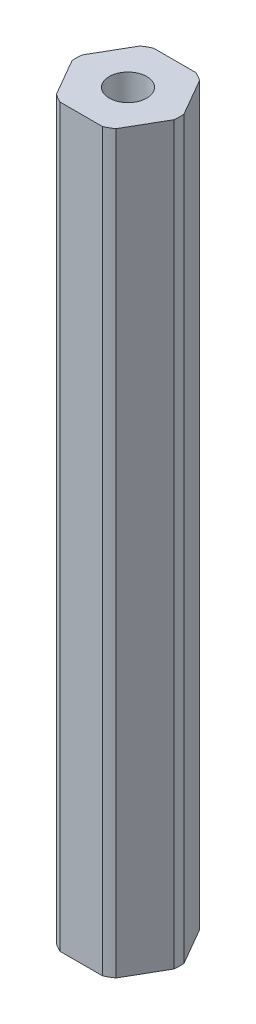
ISO-10303-21;
HEADER;
FILE_DESCRIPTION(('STEP AP214'),'2;1');
FILE_NAME('part.step','',(''),(''),'','','');
FILE_SCHEMA(('AUTOMOTIVE_DESIGN { 1 0 10303 214 1 1 1 1 }'));
ENDSEC;
DATA;
#1=APPLICATION_CONTEXT('core data for automotive mechanical design processes');
#2=APPLICATION_PROTOCOL_DEFINITION('international standard','automotive_design',2000,#1);
#3=PRODUCT_CONTEXT('',#1,'mechanical');
#4=PRODUCT('Part','Part','',(#3));
#5=PRODUCT_RELATED_PRODUCT_CATEGORY('part','',(#4));
#6=PRODUCT_DEFINITION_FORMATION('','',#4);
#7=PRODUCT_DEFINITION_CONTEXT('part definition',#1,'design');
#8=PRODUCT_DEFINITION('design','',#6,#7);
#9=PRODUCT_DEFINITION_SHAPE('','',#8);
#10=(LENGTH_UNIT() NAMED_UNIT(*) SI_UNIT(.MILLI.,.METRE.));
#11=(NAMED_UNIT(*) PLANE_ANGLE_UNIT() SI_UNIT($,.RADIAN.));
#12=(NAMED_UNIT(*) SI_UNIT($,.STERADIAN.) SOLID_ANGLE_UNIT());
#13=UNCERTAINTY_MEASURE_WITH_UNIT(LENGTH_MEASURE(1.E-05),#10,'distance_accuracy_value','');
#14=(GEOMETRIC_REPRESENTATION_CONTEXT(3) GLOBAL_UNCERTAINTY_ASSIGNED_CONTEXT((#13)) GLOBAL_UNIT_ASSIGNED_CONTEXT((#10,
#11,#12)) REPRESENTATION_CONTEXT('',''));
#15=CARTESIAN_POINT('',(0.,0.,0.));
#16=DIRECTION('',(0.,0.,1.));
#17=DIRECTION('',(1.,0.,0.));
#18=AXIS2_PLACEMENT_3D('',#15,#16,#17);
#19=CARTESIAN_POINT('',(0.,50.00625,6.35));
#20=DIRECTION('',(0.,0.,-1.));
#21=DIRECTION('',(-1.,0.,0.));
#22=AXIS2_PLACEMENT_3D('',#19,#20,#21);
#23=PLANE('',#22);
#24=DIRECTION('',(1.,0.,0.));
#25=VECTOR('',#24,1.);
#26=CARTESIAN_POINT('',(0.,-50.00625,6.35));
#27=LINE('',#26,#25);
#28=CARTESIAN_POINT('',(-2.89465988027954,-50.00625,6.35));
#29=VERTEX_POINT('',#28);
#30=CARTESIAN_POINT('',(2.89465988027954,-50.00625,6.35));
#31=VERTEX_POINT('',#30);
#32=EDGE_CURVE('E163',#29,#31,#27,.T.);
#33=ORIENTED_EDGE('',*,*,#32,.T.);
#34=DIRECTION('',(0.,-1.,0.));
#35=VECTOR('',#34,1.);
#36=CARTESIAN_POINT('',(2.89465988027954,50.00625,6.35));
#37=LINE('',#36,#35);
#38=CARTESIAN_POINT('',(2.89465988027954,50.00625,6.35));
#39=VERTEX_POINT('',#38);
#40=EDGE_CURVE('E11',#39,#31,#37,.T.);
#41=ORIENTED_EDGE('',*,*,#40,.F.);
#42=DIRECTION('',(1.,0.,0.));
#43=VECTOR('',#42,1.);
#44=CARTESIAN_POINT('',(0.,50.00625,6.35));
#45=LINE('',#44,#43);
#46=CARTESIAN_POINT('',(-2.89465988027954,50.00625,6.35));
#47=VERTEX_POINT('',#46);
#48=EDGE_CURVE('E222',#47,#39,#45,.T.);
#49=ORIENTED_EDGE('',*,*,#48,.F.);
#50=DIRECTION('',(0.,-1.,0.));
#51=VECTOR('',#50,1.);
#52=CARTESIAN_POINT('',(-2.89465988027954,50.00625,6.35));
#53=LINE('',#52,#51);
#54=EDGE_CURVE('E156',#47,#29,#53,.T.);
#55=ORIENTED_EDGE('',*,*,#54,.T.);
#56=EDGE_LOOP('',(#33,#41,#49,#55));
#57=FACE_BOUND('',#56,.T.);
#58=ADVANCED_FACE('F38',(#57),#23,.F.);
#59=CARTESIAN_POINT('',(0.,50.00625,0.));
#60=DIRECTION('',(0.,-1.,0.));
#61=DIRECTION('',(0.,0.,-1.));
#62=AXIS2_PLACEMENT_3D('',#59,#60,#61);
#63=CYLINDRICAL_SURFACE('',#62,6.97865);
#64=CARTESIAN_POINT('',(0.,-50.00625,0.));
#65=DIRECTION('',(0.,1.,0.));
#66=DIRECTION('',(0.,0.,1.));
#67=AXIS2_PLACEMENT_3D('',#64,#65,#66);
#68=CIRCLE('',#67,6.97865);
#69=CARTESIAN_POINT('',(4.05193137389142,-50.00625,5.68184899163771));
#70=VERTEX_POINT('',#69);
#71=EDGE_CURVE('E166',#31,#70,#68,.T.);
#72=ORIENTED_EDGE('',*,*,#71,.T.);
#73=DIRECTION('',(0.,-1.,0.));
#74=VECTOR('',#73,1.);
#75=CARTESIAN_POINT('',(4.05193137389142,50.00625,5.68184899163771));
#76=LINE('',#75,#74);
#77=CARTESIAN_POINT('',(4.05193137389142,50.00625,5.68184899163771));
#78=VERTEX_POINT('',#77);
#79=EDGE_CURVE('E47',#78,#70,#76,.T.);
#80=ORIENTED_EDGE('',*,*,#79,.F.);
#81=CARTESIAN_POINT('',(0.,50.00625,0.));
#82=DIRECTION('',(0.,1.,0.));
#83=DIRECTION('',(0.,0.,1.));
#84=AXIS2_PLACEMENT_3D('',#81,#82,#83);
#85=CIRCLE('',#84,6.97865);
#86=EDGE_CURVE('E110',#39,#78,#85,.T.);
#87=ORIENTED_EDGE('',*,*,#86,.F.);
#88=ORIENTED_EDGE('',*,*,#40,.T.);
#89=EDGE_LOOP('',(#72,#80,#87,#88));
#90=FACE_BOUND('',#89,.T.);
#91=ADVANCED_FACE('F257',(#90),#63,.T.);
#92=CARTESIAN_POINT('',(5.49926131403119,50.00625,3.175));
#93=DIRECTION('',(-0.866025403784439,0.,-0.5));
#94=DIRECTION('',(-0.5,0.,0.866025403784439));
#95=AXIS2_PLACEMENT_3D('',#92,#93,#94);
#96=PLANE('',#95);
#97=DIRECTION('',(0.5,0.,-0.866025403784439));
#98=VECTOR('',#97,1.);
#99=CARTESIAN_POINT('',(5.49926131403119,-50.00625,3.175));
#100=LINE('',#99,#98);
#101=CARTESIAN_POINT('',(6.94659125417096,-50.00625,0.668151008362288));
#102=VERTEX_POINT('',#101);
#103=EDGE_CURVE('E168',#70,#102,#100,.T.);
#104=ORIENTED_EDGE('',*,*,#103,.T.);
#105=DIRECTION('',(0.,-1.,0.));
#106=VECTOR('',#105,1.);
#107=CARTESIAN_POINT('',(6.94659125417096,50.00625,0.668151008362288));
#108=LINE('',#107,#106);
#109=CARTESIAN_POINT('',(6.94659125417096,50.00625,0.668151008362288));
#110=VERTEX_POINT('',#109);
#111=EDGE_CURVE('E198',#110,#102,#108,.T.);
#112=ORIENTED_EDGE('',*,*,#111,.F.);
#113=DIRECTION('',(0.5,0.,-0.866025403784439));
#114=VECTOR('',#113,1.);
#115=CARTESIAN_POINT('',(5.49926131403119,50.00625,3.175));
#116=LINE('',#115,#114);
#117=EDGE_CURVE('E206',#78,#110,#116,.T.);
#118=ORIENTED_EDGE('',*,*,#117,.F.);
#119=ORIENTED_EDGE('',*,*,#79,.T.);
#120=EDGE_LOOP('',(#104,#112,#118,#119));
#121=FACE_BOUND('',#120,.T.);
#122=ADVANCED_FACE('F204',(#121),#96,.F.);
#123=CARTESIAN_POINT('',(6.94659125417096,-50.00625,-0.66815100836229));
#124=VERTEX_POINT('',#123);
#125=EDGE_CURVE('E169',#102,#124,#68,.T.);
#126=ORIENTED_EDGE('',*,*,#125,.T.);
#127=DIRECTION('',(0.,-1.,0.));
#128=VECTOR('',#127,1.);
#129=CARTESIAN_POINT('',(6.94659125417096,50.00625,-0.66815100836229));
#130=LINE('',#129,#128);
#131=CARTESIAN_POINT('',(6.94659125417096,50.00625,-0.66815100836229));
#132=VERTEX_POINT('',#131);
#133=EDGE_CURVE('E195',#132,#124,#130,.T.);
#134=ORIENTED_EDGE('',*,*,#133,.F.);
#135=EDGE_CURVE('E228',#110,#132,#85,.T.);
#136=ORIENTED_EDGE('',*,*,#135,.F.);
#137=ORIENTED_EDGE('',*,*,#111,.T.);
#138=EDGE_LOOP('',(#126,#134,#136,#137));
#139=FACE_BOUND('',#138,.T.);
#140=ADVANCED_FACE('F239',(#139),#63,.T.);
#141=CARTESIAN_POINT('',(5.49926131403118,50.00625,-3.175));
#142=DIRECTION('',(-0.866025403784438,0.,0.5));
#143=DIRECTION('',(0.5,0.,0.866025403784438));
#144=AXIS2_PLACEMENT_3D('',#141,#142,#143);
#145=PLANE('',#144);
#146=DIRECTION('',(-0.5,0.,-0.866025403784438));
#147=VECTOR('',#146,1.);
#148=CARTESIAN_POINT('',(5.49926131403118,-50.00625,-3.175));
#149=LINE('',#148,#147);
#150=CARTESIAN_POINT('',(4.05193137389141,-50.00625,-5.68184899163771));
#151=VERTEX_POINT('',#150);
#152=EDGE_CURVE('E171',#124,#151,#149,.T.);
#153=ORIENTED_EDGE('',*,*,#152,.T.);
#154=DIRECTION('',(0.,-1.,0.));
#155=VECTOR('',#154,1.);
#156=CARTESIAN_POINT('',(4.05193137389141,50.00625,-5.68184899163771));
#157=LINE('',#156,#155);
#158=CARTESIAN_POINT('',(4.05193137389141,50.00625,-5.68184899163771));
#159=VERTEX_POINT('',#158);
#160=EDGE_CURVE('E192',#159,#151,#157,.T.);
#161=ORIENTED_EDGE('',*,*,#160,.F.);
#162=DIRECTION('',(-0.5,0.,-0.866025403784438));
#163=VECTOR('',#162,1.);
#164=CARTESIAN_POINT('',(5.49926131403118,50.00625,-3.175));
#165=LINE('',#164,#163);
#166=EDGE_CURVE('E230',#132,#159,#165,.T.);
#167=ORIENTED_EDGE('',*,*,#166,.F.);
#168=ORIENTED_EDGE('',*,*,#133,.T.);
#169=EDGE_LOOP('',(#153,#161,#167,#168));
#170=FACE_BOUND('',#169,.T.);
#171=ADVANCED_FACE('F241',(#170),#145,.F.);
#172=CARTESIAN_POINT('',(2.89465988027954,-50.00625,-6.35));
#173=VERTEX_POINT('',#172);
#174=EDGE_CURVE('E173',#151,#173,#68,.T.);
#175=ORIENTED_EDGE('',*,*,#174,.T.);
#176=DIRECTION('',(0.,-1.,0.));
#177=VECTOR('',#176,1.);
#178=CARTESIAN_POINT('',(2.89465988027954,50.00625,-6.35));
#179=LINE('',#178,#177);
#180=CARTESIAN_POINT('',(2.89465988027954,50.00625,-6.35));
#181=VERTEX_POINT('',#180);
#182=EDGE_CURVE('E189',#181,#173,#179,.T.);
#183=ORIENTED_EDGE('',*,*,#182,.F.);
#184=EDGE_CURVE('E231',#159,#181,#85,.T.);
#185=ORIENTED_EDGE('',*,*,#184,.F.);
#186=ORIENTED_EDGE('',*,*,#160,.T.);
#187=EDGE_LOOP('',(#175,#183,#185,#186));
#188=FACE_BOUND('',#187,.T.);
#189=ADVANCED_FACE('F242',(#188),#63,.T.);
#190=CARTESIAN_POINT('',(0.,50.00625,-6.35));
#191=DIRECTION('',(0.,0.,1.));
#192=DIRECTION('',(1.,0.,0.));
#193=AXIS2_PLACEMENT_3D('',#190,#191,#192);
#194=PLANE('',#193);
#195=DIRECTION('',(-1.,0.,0.));
#196=VECTOR('',#195,1.);
#197=CARTESIAN_POINT('',(0.,-50.00625,-6.35));
#198=LINE('',#197,#196);
#199=CARTESIAN_POINT('',(-2.89465988027954,-50.00625,-6.35));
#200=VERTEX_POINT('',#199);
#201=EDGE_CURVE('E174',#173,#200,#198,.T.);
#202=ORIENTED_EDGE('',*,*,#201,.T.);
#203=DIRECTION('',(0.,-1.,0.));
#204=VECTOR('',#203,1.);
#205=CARTESIAN_POINT('',(-2.89465988027954,50.00625,-6.35));
#206=LINE('',#205,#204);
#207=CARTESIAN_POINT('',(-2.89465988027954,50.00625,-6.35));
#208=VERTEX_POINT('',#207);
#209=EDGE_CURVE('E186',#208,#200,#206,.T.);
#210=ORIENTED_EDGE('',*,*,#209,.F.);
#211=DIRECTION('',(-1.,0.,0.));
#212=VECTOR('',#211,1.);
#213=CARTESIAN_POINT('',(0.,50.00625,-6.35));
#214=LINE('',#213,#212);
#215=EDGE_CURVE('E232',#181,#208,#214,.T.);
#216=ORIENTED_EDGE('',*,*,#215,.F.);
#217=ORIENTED_EDGE('',*,*,#182,.T.);
#218=EDGE_LOOP('',(#202,#210,#216,#217));
#219=FACE_BOUND('',#218,.T.);
#220=ADVANCED_FACE('F245',(#219),#194,.F.);
#221=CARTESIAN_POINT('',(-4.05193137389142,-50.00625,-5.68184899163771));
#222=VERTEX_POINT('',#221);
#223=EDGE_CURVE('E176',#200,#222,#68,.T.);
#224=ORIENTED_EDGE('',*,*,#223,.T.);
#225=DIRECTION('',(0.,-1.,0.));
#226=VECTOR('',#225,1.);
#227=CARTESIAN_POINT('',(-4.05193137389142,50.00625,-5.68184899163771));
#228=LINE('',#227,#226);
#229=CARTESIAN_POINT('',(-4.05193137389142,50.00625,-5.68184899163771));
#230=VERTEX_POINT('',#229);
#231=EDGE_CURVE('E183',#230,#222,#228,.T.);
#232=ORIENTED_EDGE('',*,*,#231,.F.);
#233=EDGE_CURVE('E146',#208,#230,#85,.T.);
#234=ORIENTED_EDGE('',*,*,#233,.F.);
#235=ORIENTED_EDGE('',*,*,#209,.T.);
#236=EDGE_LOOP('',(#224,#232,#234,#235));
#237=FACE_BOUND('',#236,.T.);
#238=ADVANCED_FACE('F247',(#237),#63,.T.);
#239=CARTESIAN_POINT('',(-5.49926131403119,50.00625,-3.175));
#240=DIRECTION('',(0.866025403784439,0.,0.5));
#241=DIRECTION('',(0.5,0.,-0.866025403784439));
#242=AXIS2_PLACEMENT_3D('',#239,#240,#241);
#243=PLANE('',#242);
#244=DIRECTION('',(-0.5,0.,0.866025403784439));
#245=VECTOR('',#244,1.);
#246=CARTESIAN_POINT('',(-5.49926131403119,-50.00625,-3.175));
#247=LINE('',#246,#245);
#248=CARTESIAN_POINT('',(-6.94659125417096,-50.00625,-0.668151008362297));
#249=VERTEX_POINT('',#248);
#250=EDGE_CURVE('E177',#222,#249,#247,.T.);
#251=ORIENTED_EDGE('',*,*,#250,.T.);
#252=DIRECTION('',(0.,-1.,0.));
#253=VECTOR('',#252,1.);
#254=CARTESIAN_POINT('',(-6.94659125417096,50.00625,-0.668151008362297));
#255=LINE('',#254,#253);
#256=CARTESIAN_POINT('',(-6.94659125417096,50.00625,-0.668151008362297));
#257=VERTEX_POINT('',#256);
#258=EDGE_CURVE('E151',#257,#249,#255,.T.);
#259=ORIENTED_EDGE('',*,*,#258,.F.);
#260=DIRECTION('',(-0.5,0.,0.866025403784439));
#261=VECTOR('',#260,1.);
#262=CARTESIAN_POINT('',(-5.49926131403119,50.00625,-3.175));
#263=LINE('',#262,#261);
#264=EDGE_CURVE('E141',#230,#257,#263,.T.);
#265=ORIENTED_EDGE('',*,*,#264,.F.);
#266=ORIENTED_EDGE('',*,*,#231,.T.);
#267=EDGE_LOOP('',(#251,#259,#265,#266));
#268=FACE_BOUND('',#267,.T.);
#269=ADVANCED_FACE('F250',(#268),#243,.F.);
#270=CARTESIAN_POINT('',(-6.94659125417096,-50.00625,0.668151008362299));
#271=VERTEX_POINT('',#270);
#272=EDGE_CURVE('E150',#249,#271,#68,.T.);
#273=ORIENTED_EDGE('',*,*,#272,.T.);
#274=DIRECTION('',(0.,-1.,0.));
#275=VECTOR('',#274,1.);
#276=CARTESIAN_POINT('',(-6.94659125417096,50.00625,0.668151008362299));
#277=LINE('',#276,#275);
#278=CARTESIAN_POINT('',(-6.94659125417096,50.00625,0.668151008362299));
#279=VERTEX_POINT('',#278);
#280=EDGE_CURVE('E147',#279,#271,#277,.T.);
#281=ORIENTED_EDGE('',*,*,#280,.F.);
#282=EDGE_CURVE('E135',#257,#279,#85,.T.);
#283=ORIENTED_EDGE('',*,*,#282,.F.);
#284=ORIENTED_EDGE('',*,*,#258,.T.);
#285=EDGE_LOOP('',(#273,#281,#283,#284));
#286=FACE_BOUND('',#285,.T.);
#287=ADVANCED_FACE('F148',(#286),#63,.T.);
#288=CARTESIAN_POINT('',(-5.49926131403119,50.00625,3.175));
#289=DIRECTION('',(0.866025403784438,0.,-0.5));
#290=DIRECTION('',(-0.5,0.,-0.866025403784439));
#291=AXIS2_PLACEMENT_3D('',#288,#289,#290);
#292=PLANE('',#291);
#293=DIRECTION('',(0.5,0.,0.866025403784439));
#294=VECTOR('',#293,1.);
#295=CARTESIAN_POINT('',(-5.49926131403119,-50.00625,3.175));
#296=LINE('',#295,#294);
#297=CARTESIAN_POINT('',(-4.05193137389142,-50.00625,5.68184899163771));
#298=VERTEX_POINT('',#297);
#299=EDGE_CURVE('E96',#271,#298,#296,.T.);
#300=ORIENTED_EDGE('',*,*,#299,.T.);
#301=DIRECTION('',(0.,-1.,0.));
#302=VECTOR('',#301,1.);
#303=CARTESIAN_POINT('',(-4.05193137389142,50.00625,5.68184899163771));
#304=LINE('',#303,#302);
#305=CARTESIAN_POINT('',(-4.05193137389142,50.00625,5.68184899163771));
#306=VERTEX_POINT('',#305);
#307=EDGE_CURVE('E152',#306,#298,#304,.T.);
#308=ORIENTED_EDGE('',*,*,#307,.F.);
#309=DIRECTION('',(0.5,0.,0.866025403784439));
#310=VECTOR('',#309,1.);
#311=CARTESIAN_POINT('',(-5.49926131403119,50.00625,3.175));
#312=LINE('',#311,#310);
#313=EDGE_CURVE('E139',#279,#306,#312,.T.);
#314=ORIENTED_EDGE('',*,*,#313,.F.);
#315=ORIENTED_EDGE('',*,*,#280,.T.);
#316=EDGE_LOOP('',(#300,#308,#314,#315));
#317=FACE_BOUND('',#316,.T.);
#318=ADVANCED_FACE('F154',(#317),#292,.F.);
#319=CARTESIAN_POINT('',(0.,50.00625,0.));
#320=DIRECTION('',(0.,-1.,0.));
#321=DIRECTION('',(0.,0.,-1.));
#322=AXIS2_PLACEMENT_3D('',#319,#320,#321);
#323=CYLINDRICAL_SURFACE('',#322,2.5527);
#324=CARTESIAN_POINT('',(0.,50.00625,0.));
#325=DIRECTION('',(0.,1.,0.));
#326=DIRECTION('',(0.,0.,1.));
#327=AXIS2_PLACEMENT_3D('',#324,#325,#326);
#328=CIRCLE('',#327,2.5527);
#329=CARTESIAN_POINT('',(0.,50.00625,-2.5527));
#330=VERTEX_POINT('',#329);
#331=EDGE_CURVE('E220',#330,#330,#328,.T.);
#332=CARTESIAN_POINT('',(0.,-50.00625,0.));
#333=DIRECTION('',(0.,1.,0.));
#334=DIRECTION('',(0.,0.,1.));
#335=AXIS2_PLACEMENT_3D('',#332,#333,#334);
#336=CIRCLE('',#335,2.5527);
#337=CARTESIAN_POINT('',(0.,-50.00625,-2.5527));
#338=VERTEX_POINT('',#337);
#339=EDGE_CURVE('E160',#338,#338,#336,.T.);
#340=CARTESIAN_POINT('',(0.,50.00625,-2.5527));
#341=CARTESIAN_POINT('',(0.,48.964453125,-2.5527));
#342=CARTESIAN_POINT('',(0.,47.92265625,-2.5527));
#343=CARTESIAN_POINT('',(0.,45.8390625,-2.5527));
#344=CARTESIAN_POINT('',(0.,44.797265625,-2.5527));
#345=CARTESIAN_POINT('',(0.,42.713671875,-2.5527));
#346=CARTESIAN_POINT('',(0.,41.671875,-2.5527));
#347=CARTESIAN_POINT('',(0.,39.58828125,-2.5527));
#348=CARTESIAN_POINT('',(0.,38.546484375,-2.5527));
#349=CARTESIAN_POINT('',(0.,36.462890625,-2.5527));
#350=CARTESIAN_POINT('',(0.,35.42109375,-2.5527));
#351=CARTESIAN_POINT('',(0.,33.3375,-2.5527));
#352=CARTESIAN_POINT('',(0.,32.295703125,-2.5527));
#353=CARTESIAN_POINT('',(0.,30.212109375,-2.5527));
#354=CARTESIAN_POINT('',(0.,29.1703125,-2.5527));
#355=CARTESIAN_POINT('',(0.,27.08671875,-2.5527));
#356=CARTESIAN_POINT('',(0.,26.044921875,-2.5527));
#357=CARTESIAN_POINT('',(0.,23.961328125,-2.5527));
#358=CARTESIAN_POINT('',(0.,22.91953125,-2.5527));
#359=CARTESIAN_POINT('',(0.,20.8359375,-2.5527));
#360=CARTESIAN_POINT('',(0.,19.794140625,-2.5527));
#361=CARTESIAN_POINT('',(0.,17.710546875,-2.5527));
#362=CARTESIAN_POINT('',(0.,16.66875,-2.5527));
#363=CARTESIAN_POINT('',(0.,14.58515625,-2.5527));
#364=CARTESIAN_POINT('',(0.,13.543359375,-2.5527));
#365=CARTESIAN_POINT('',(0.,11.459765625,-2.5527));
#366=CARTESIAN_POINT('',(0.,10.41796875,-2.5527));
#367=CARTESIAN_POINT('',(0.,8.33437499999999,-2.5527));
#368=CARTESIAN_POINT('',(0.,7.292578125,-2.5527));
#369=CARTESIAN_POINT('',(0.,5.208984375,-2.5527));
#370=CARTESIAN_POINT('',(0.,4.1671875,-2.5527));
#371=CARTESIAN_POINT('',(0.,2.08359374999999,-2.5527));
#372=CARTESIAN_POINT('',(0.,1.04179687499999,-2.5527));
#373=CARTESIAN_POINT('',(0.,-1.04179687500001,-2.5527));
#374=CARTESIAN_POINT('',(0.,-2.08359375000001,-2.5527));
#375=CARTESIAN_POINT('',(0.,-4.16718750000001,-2.5527));
#376=CARTESIAN_POINT('',(0.,-5.20898437500001,-2.5527));
#377=CARTESIAN_POINT('',(0.,-7.29257812500001,-2.5527));
#378=CARTESIAN_POINT('',(0.,-8.33437500000001,-2.5527));
#379=CARTESIAN_POINT('',(0.,-10.41796875,-2.5527));
#380=CARTESIAN_POINT('',(0.,-11.459765625,-2.5527));
#381=CARTESIAN_POINT('',(0.,-13.543359375,-2.5527));
#382=CARTESIAN_POINT('',(0.,-14.58515625,-2.5527));
#383=CARTESIAN_POINT('',(0.,-16.66875,-2.5527));
#384=CARTESIAN_POINT('',(0.,-17.710546875,-2.5527));
#385=CARTESIAN_POINT('',(0.,-19.794140625,-2.5527));
#386=CARTESIAN_POINT('',(0.,-20.8359375,-2.5527));
#387=CARTESIAN_POINT('',(0.,-22.91953125,-2.5527));
#388=CARTESIAN_POINT('',(0.,-23.961328125,-2.5527));
#389=CARTESIAN_POINT('',(0.,-26.044921875,-2.5527));
#390=CARTESIAN_POINT('',(0.,-27.08671875,-2.5527));
#391=CARTESIAN_POINT('',(0.,-29.1703125,-2.5527));
#392=CARTESIAN_POINT('',(0.,-30.212109375,-2.5527));
#393=CARTESIAN_POINT('',(0.,-32.295703125,-2.5527));
#394=CARTESIAN_POINT('',(0.,-33.3375,-2.5527));
#395=CARTESIAN_POINT('',(0.,-35.42109375,-2.5527));
#396=CARTESIAN_POINT('',(0.,-36.462890625,-2.5527));
#397=CARTESIAN_POINT('',(0.,-38.546484375,-2.5527));
#398=CARTESIAN_POINT('',(0.,-39.58828125,-2.5527));
#399=CARTESIAN_POINT('',(0.,-41.671875,-2.5527));
#400=CARTESIAN_POINT('',(0.,-42.713671875,-2.5527));
#401=CARTESIAN_POINT('',(0.,-44.797265625,-2.5527));
#402=CARTESIAN_POINT('',(0.,-45.8390625,-2.5527));
#403=CARTESIAN_POINT('',(0.,-47.92265625,-2.5527));
#404=CARTESIAN_POINT('',(0.,-48.964453125,-2.5527));
#405=CARTESIAN_POINT('',(0.,-50.00625,-2.5527));
#406=B_SPLINE_CURVE_WITH_KNOTS('',3,(#340,#341,#342,#343,#344,#345,#346,#347,#348,#349,#350,
#351,#352,#353,#354,#355,#356,#357,#358,#359,#360,#361,#362,#363,#364,#365,#366,#367,#368,#369,
#370,#371,#372,#373,#374,#375,#376,#377,#378,#379,#380,#381,#382,#383,#384,#385,#386,#387,#388,
#389,#390,#391,#392,#393,#394,#395,#396,#397,#398,#399,#400,#401,#402,#403,#404,#405),
.UNSPECIFIED.,.F.,.F.,(4,2,2,2,2,2,2,2,2,2,2,2,2,2,2,2,2,2,2,2,2,2,2,2,2,2,2,2,2,2,2,2,4),(0.,
3.12539062499999,6.25078125,9.37617187499999,12.5015625,15.626953125,18.75234375,21.877734375,
25.003125,28.128515625,31.25390625,34.379296875,37.5046875,40.630078125,43.75546875,
46.880859375,50.00625,53.131640625,56.25703125,59.382421875,62.5078125,65.633203125,68.75859375,
71.883984375,75.009375,78.134765625,81.26015625,84.385546875,87.5109375,90.636328125,
93.76171875,96.887109375,100.0125),.UNSPECIFIED.);
#407=EDGE_CURVE('BSEAM40',#330,#338,#406,.T.);
#408=ORIENTED_EDGE('',*,*,#331,.T.);
#409=ORIENTED_EDGE('',*,*,#339,.F.);
#410=ORIENTED_EDGE('',*,*,#407,.T.);
#411=ORIENTED_EDGE('',*,*,#407,.F.);
#412=EDGE_LOOP('',(#408,#410,#409,#411));
#413=FACE_BOUND('',#412,.T.);
#414=ADVANCED_FACE('F40',(#413),#323,.F.);
#415=EDGE_CURVE('E102',#298,#29,#68,.T.);
#416=ORIENTED_EDGE('',*,*,#415,.T.);
#417=ORIENTED_EDGE('',*,*,#54,.F.);
#418=EDGE_CURVE('E55',#306,#47,#85,.T.);
#419=ORIENTED_EDGE('',*,*,#418,.F.);
#420=ORIENTED_EDGE('',*,*,#307,.T.);
#421=EDGE_LOOP('',(#416,#417,#419,#420));
#422=FACE_BOUND('',#421,.T.);
#423=ADVANCED_FACE('F254',(#422),#63,.T.);
#424=CARTESIAN_POINT('',(0.,50.00625,0.));
#425=DIRECTION('',(0.,1.,0.));
#426=DIRECTION('',(0.,0.,1.));
#427=AXIS2_PLACEMENT_3D('',#424,#425,#426);
#428=PLANE('',#427);
#429=ORIENTED_EDGE('',*,*,#331,.F.);
#430=EDGE_LOOP('',(#429));
#431=FACE_BOUND('',#430,.T.);
#432=ORIENTED_EDGE('',*,*,#48,.T.);
#433=ORIENTED_EDGE('',*,*,#86,.T.);
#434=ORIENTED_EDGE('',*,*,#117,.T.);
#435=ORIENTED_EDGE('',*,*,#135,.T.);
#436=ORIENTED_EDGE('',*,*,#166,.T.);
#437=ORIENTED_EDGE('',*,*,#184,.T.);
#438=ORIENTED_EDGE('',*,*,#215,.T.);
#439=ORIENTED_EDGE('',*,*,#233,.T.);
#440=ORIENTED_EDGE('',*,*,#264,.T.);
#441=ORIENTED_EDGE('',*,*,#282,.T.);
#442=ORIENTED_EDGE('',*,*,#313,.T.);
#443=ORIENTED_EDGE('',*,*,#418,.T.);
#444=EDGE_LOOP('',(#432,#433,#434,#435,#436,#437,#438,#439,#440,#441,#442,#443));
#445=FACE_BOUND('',#444,.T.);
#446=ADVANCED_FACE('F137',(#431,#445),#428,.T.);
#447=CARTESIAN_POINT('',(0.,-50.00625,0.));
#448=DIRECTION('',(0.,1.,0.));
#449=DIRECTION('',(0.,0.,1.));
#450=AXIS2_PLACEMENT_3D('',#447,#448,#449);
#451=PLANE('',#450);
#452=ORIENTED_EDGE('',*,*,#339,.T.);
#453=EDGE_LOOP('',(#452));
#454=FACE_BOUND('',#453,.T.);
#455=ORIENTED_EDGE('',*,*,#32,.F.);
#456=ORIENTED_EDGE('',*,*,#415,.F.);
#457=ORIENTED_EDGE('',*,*,#299,.F.);
#458=ORIENTED_EDGE('',*,*,#272,.F.);
#459=ORIENTED_EDGE('',*,*,#250,.F.);
#460=ORIENTED_EDGE('',*,*,#223,.F.);
#461=ORIENTED_EDGE('',*,*,#201,.F.);
#462=ORIENTED_EDGE('',*,*,#174,.F.);
#463=ORIENTED_EDGE('',*,*,#152,.F.);
#464=ORIENTED_EDGE('',*,*,#125,.F.);
#465=ORIENTED_EDGE('',*,*,#103,.F.);
#466=ORIENTED_EDGE('',*,*,#71,.F.);
#467=EDGE_LOOP('',(#455,#456,#457,#458,#459,#460,#461,#462,#463,#464,#465,#466));
#468=FACE_BOUND('',#467,.T.);
#469=ADVANCED_FACE('F210',(#454,#468),#451,.F.);
#470=CLOSED_SHELL('',(#58,#91,#122,#140,#171,#189,#220,#238,#269,#287,#318,#414,#423,#446,#469));
#471=MANIFOLD_SOLID_BREP('B2',#470);
#472=ADVANCED_BREP_SHAPE_REPRESENTATION('',(#18,#471),#14);
#473=SHAPE_DEFINITION_REPRESENTATION(#9,#472);
ENDSEC;
END-ISO-10303-21;
